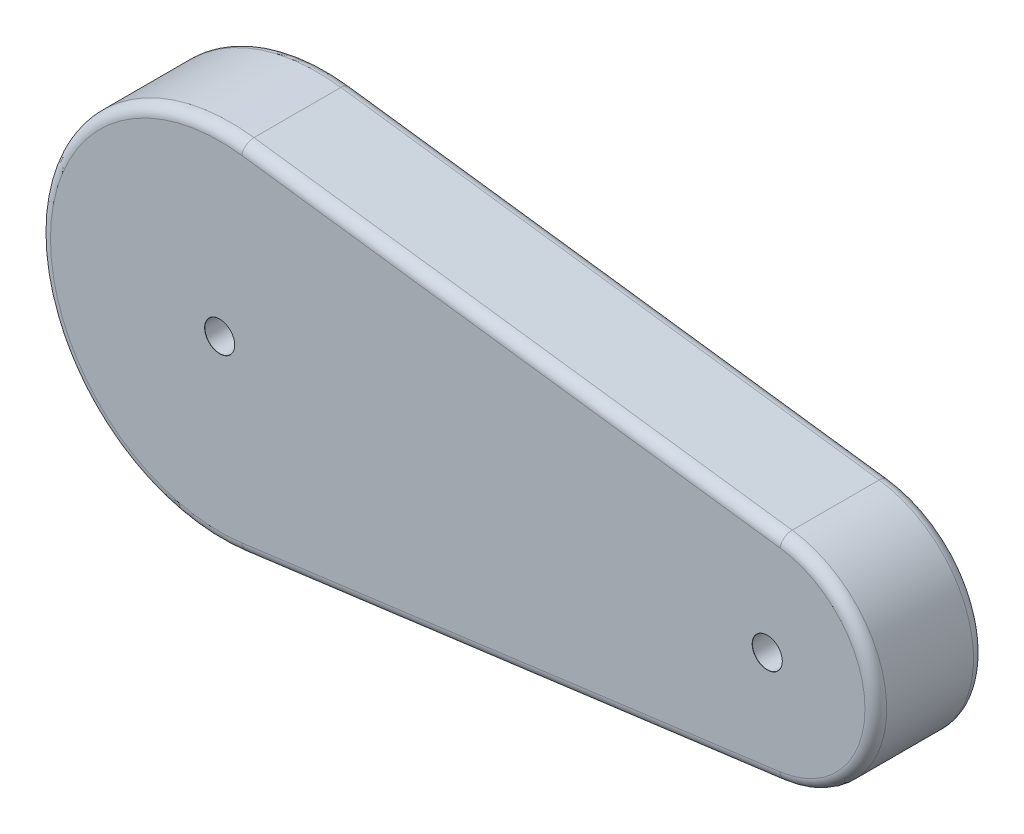
ISO-10303-21;
HEADER;
FILE_DESCRIPTION(('STEP AP214'),'2;1');
FILE_NAME('part.step','',(''),(''),'','','');
FILE_SCHEMA(('AUTOMOTIVE_DESIGN { 1 0 10303 214 1 1 1 1 }'));
ENDSEC;
DATA;
#1=APPLICATION_CONTEXT('core data for automotive mechanical design processes');
#2=APPLICATION_PROTOCOL_DEFINITION('international standard','automotive_design',2000,#1);
#3=PRODUCT_CONTEXT('',#1,'mechanical');
#4=PRODUCT('Part','Part','',(#3));
#5=PRODUCT_RELATED_PRODUCT_CATEGORY('part','',(#4));
#6=PRODUCT_DEFINITION_FORMATION('','',#4);
#7=PRODUCT_DEFINITION_CONTEXT('part definition',#1,'design');
#8=PRODUCT_DEFINITION('design','',#6,#7);
#9=PRODUCT_DEFINITION_SHAPE('','',#8);
#10=(LENGTH_UNIT() NAMED_UNIT(*) SI_UNIT(.MILLI.,.METRE.));
#11=(NAMED_UNIT(*) PLANE_ANGLE_UNIT() SI_UNIT($,.RADIAN.));
#12=(NAMED_UNIT(*) SI_UNIT($,.STERADIAN.) SOLID_ANGLE_UNIT());
#13=UNCERTAINTY_MEASURE_WITH_UNIT(LENGTH_MEASURE(1.E-05),#10,'distance_accuracy_value','');
#14=(GEOMETRIC_REPRESENTATION_CONTEXT(3) GLOBAL_UNCERTAINTY_ASSIGNED_CONTEXT((#13)) GLOBAL_UNIT_ASSIGNED_CONTEXT((#10,
#11,#12)) REPRESENTATION_CONTEXT('',''));
#15=CARTESIAN_POINT('',(0.,0.,0.));
#16=DIRECTION('',(0.,0.,1.));
#17=DIRECTION('',(1.,0.,0.));
#18=AXIS2_PLACEMENT_3D('',#15,#16,#17);
#19=CARTESIAN_POINT('',(-50.4314480290076,0.,10.));
#20=DIRECTION('',(0.,0.,-1.));
#21=DIRECTION('',(-1.,0.,0.));
#22=AXIS2_PLACEMENT_3D('',#19,#20,#21);
#23=CYLINDRICAL_SURFACE('',#22,33.1652497587393);
#24=DIRECTION('',(0.,0.,-1.));
#25=VECTOR('',#24,1.);
#26=CARTESIAN_POINT('',(-46.1025142639725,32.8815164494811,10.));
#27=LINE('',#26,#25);
#28=CARTESIAN_POINT('',(-46.1025142639725,32.8815164494811,8.));
#29=VERTEX_POINT('',#28);
#30=CARTESIAN_POINT('',(-46.1025142639725,32.8815164494811,-8.));
#31=VERTEX_POINT('',#30);
#32=EDGE_CURVE('E104',#29,#31,#27,.T.);
#33=ORIENTED_EDGE('',*,*,#32,.T.);
#34=CARTESIAN_POINT('',(-50.4314480290076,0.,-8.));
#35=DIRECTION('',(0.,0.,-1.));
#36=DIRECTION('',(-1.,0.,0.));
#37=AXIS2_PLACEMENT_3D('',#34,#35,#36);
#38=CIRCLE('',#37,33.1652497587393);
#39=CARTESIAN_POINT('',(-46.1025142639725,-32.8815164494811,-8.));
#40=VERTEX_POINT('',#39);
#41=EDGE_CURVE('E201',#31,#40,#38,.F.);
#42=ORIENTED_EDGE('',*,*,#41,.T.);
#43=DIRECTION('',(0.,0.,-1.));
#44=VECTOR('',#43,1.);
#45=CARTESIAN_POINT('',(-46.1025142639725,-32.8815164494811,10.));
#46=LINE('',#45,#44);
#47=CARTESIAN_POINT('',(-46.1025142639725,-32.8815164494811,8.));
#48=VERTEX_POINT('',#47);
#49=EDGE_CURVE('E130',#48,#40,#46,.T.);
#50=ORIENTED_EDGE('',*,*,#49,.F.);
#51=CARTESIAN_POINT('',(-50.4314480290076,0.,8.));
#52=DIRECTION('',(0.,0.,-1.));
#53=DIRECTION('',(-1.,0.,0.));
#54=AXIS2_PLACEMENT_3D('',#51,#52,#53);
#55=CIRCLE('',#54,33.1652497587393);
#56=EDGE_CURVE('E199',#48,#29,#55,.T.);
#57=ORIENTED_EDGE('',*,*,#56,.T.);
#58=EDGE_LOOP('',(#33,#42,#50,#57));
#59=FACE_BOUND('',#58,.T.);
#60=ADVANCED_FACE('F33',(#59),#23,.T.);
#61=CARTESIAN_POINT('',(53.0419718734086,-19.8288972274762,10.));
#62=DIRECTION('',(-0.130526192220049,0.991444861373811,0.));
#63=DIRECTION('',(-0.991444861373811,-0.130526192220049,0.));
#64=AXIS2_PLACEMENT_3D('',#61,#62,#63);
#65=PLANE('',#64);
#66=ORIENTED_EDGE('',*,*,#49,.T.);
#67=DIRECTION('',(0.991444861373811,0.130526192220049,0.));
#68=VECTOR('',#67,1.);
#69=CARTESIAN_POINT('',(53.0419718734086,-19.8288972274762,-8.));
#70=LINE('',#69,#68);
#71=CARTESIAN_POINT('',(53.0419718734086,-19.8288972274762,-8.));
#72=VERTEX_POINT('',#71);
#73=EDGE_CURVE('E197',#40,#72,#70,.T.);
#74=ORIENTED_EDGE('',*,*,#73,.T.);
#75=DIRECTION('',(0.,0.,-1.));
#76=VECTOR('',#75,1.);
#77=CARTESIAN_POINT('',(53.0419718734086,-19.8288972274762,10.));
#78=LINE('',#77,#76);
#79=CARTESIAN_POINT('',(53.0419718734086,-19.8288972274762,8.));
#80=VERTEX_POINT('',#79);
#81=EDGE_CURVE('E121',#80,#72,#78,.T.);
#82=ORIENTED_EDGE('',*,*,#81,.F.);
#83=DIRECTION('',(0.991444861373811,0.130526192220049,0.));
#84=VECTOR('',#83,1.);
#85=CARTESIAN_POINT('',(53.0419718734086,-19.8288972274762,8.));
#86=LINE('',#85,#84);
#87=EDGE_CURVE('E195',#80,#48,#86,.F.);
#88=ORIENTED_EDGE('',*,*,#87,.T.);
#89=EDGE_LOOP('',(#66,#74,#82,#88));
#90=FACE_BOUND('',#89,.T.);
#91=ADVANCED_FACE('F213',(#90),#65,.F.);
#92=CARTESIAN_POINT('',(50.4314480290076,0.,10.));
#93=DIRECTION('',(0.,0.,-1.));
#94=DIRECTION('',(-1.,0.,0.));
#95=AXIS2_PLACEMENT_3D('',#92,#93,#94);
#96=CYLINDRICAL_SURFACE('',#95,20.);
#97=ORIENTED_EDGE('',*,*,#81,.T.);
#98=CARTESIAN_POINT('',(50.4314480290076,0.,-8.));
#99=DIRECTION('',(0.,0.,-1.));
#100=DIRECTION('',(-1.,0.,0.));
#101=AXIS2_PLACEMENT_3D('',#98,#99,#100);
#102=CIRCLE('',#101,20.);
#103=CARTESIAN_POINT('',(53.0419718734086,19.8288972274762,-8.));
#104=VERTEX_POINT('',#103);
#105=EDGE_CURVE('E120',#72,#104,#102,.F.);
#106=ORIENTED_EDGE('',*,*,#105,.T.);
#107=DIRECTION('',(0.,0.,-1.));
#108=VECTOR('',#107,1.);
#109=CARTESIAN_POINT('',(53.0419718734086,19.8288972274762,10.));
#110=LINE('',#109,#108);
#111=CARTESIAN_POINT('',(53.0419718734086,19.8288972274762,8.));
#112=VERTEX_POINT('',#111);
#113=EDGE_CURVE('E102',#112,#104,#110,.T.);
#114=ORIENTED_EDGE('',*,*,#113,.F.);
#115=CARTESIAN_POINT('',(50.4314480290076,0.,8.));
#116=DIRECTION('',(0.,0.,-1.));
#117=DIRECTION('',(-1.,0.,0.));
#118=AXIS2_PLACEMENT_3D('',#115,#116,#117);
#119=CIRCLE('',#118,20.);
#120=EDGE_CURVE('E117',#112,#80,#119,.T.);
#121=ORIENTED_EDGE('',*,*,#120,.T.);
#122=EDGE_LOOP('',(#97,#106,#114,#121));
#123=FACE_BOUND('',#122,.T.);
#124=ADVANCED_FACE('F116',(#123),#96,.T.);
#125=CARTESIAN_POINT('',(-46.1025142639725,32.8815164494811,10.));
#126=DIRECTION('',(-0.130526192220048,-0.991444861373811,0.));
#127=DIRECTION('',(0.991444861373811,-0.130526192220048,0.));
#128=AXIS2_PLACEMENT_3D('',#125,#126,#127);
#129=PLANE('',#128);
#130=ORIENTED_EDGE('',*,*,#113,.T.);
#131=DIRECTION('',(-0.991444861373811,0.130526192220048,0.));
#132=VECTOR('',#131,1.);
#133=CARTESIAN_POINT('',(-46.1025142639725,32.8815164494811,-8.));
#134=LINE('',#133,#132);
#135=EDGE_CURVE('E11',#104,#31,#134,.T.);
#136=ORIENTED_EDGE('',*,*,#135,.T.);
#137=ORIENTED_EDGE('',*,*,#32,.F.);
#138=DIRECTION('',(-0.991444861373811,0.130526192220048,0.));
#139=VECTOR('',#138,1.);
#140=CARTESIAN_POINT('',(-46.1025142639725,32.8815164494811,8.));
#141=LINE('',#140,#139);
#142=EDGE_CURVE('E42',#29,#112,#141,.F.);
#143=ORIENTED_EDGE('',*,*,#142,.T.);
#144=EDGE_LOOP('',(#130,#136,#137,#143));
#145=FACE_BOUND('',#144,.T.);
#146=ADVANCED_FACE('F101',(#145),#129,.F.);
#147=CARTESIAN_POINT('',(-50.4314480290076,0.,10.));
#148=DIRECTION('',(0.,0.,-1.));
#149=DIRECTION('',(-1.,0.,0.));
#150=AXIS2_PLACEMENT_3D('',#147,#148,#149);
#151=PLANE('',#150);
#152=DIRECTION('',(0.991444861373811,0.130526192220049,0.));
#153=VECTOR('',#152,1.);
#154=CARTESIAN_POINT('',(-46.3635666484126,-30.8986267267335,10.));
#155=LINE('',#154,#153);
#156=CARTESIAN_POINT('',(-46.3635666484126,-30.8986267267335,10.));
#157=VERTEX_POINT('',#156);
#158=CARTESIAN_POINT('',(52.7809194889685,-17.8460075047286,10.));
#159=VERTEX_POINT('',#158);
#160=EDGE_CURVE('E50',#157,#159,#155,.T.);
#161=ORIENTED_EDGE('',*,*,#160,.T.);
#162=CARTESIAN_POINT('',(50.4314480290076,0.,10.));
#163=DIRECTION('',(0.,0.,-1.));
#164=DIRECTION('',(-1.,0.,0.));
#165=AXIS2_PLACEMENT_3D('',#162,#163,#164);
#166=CIRCLE('',#165,18.);
#167=CARTESIAN_POINT('',(52.7809194889685,17.8460075047286,10.));
#168=VERTEX_POINT('',#167);
#169=EDGE_CURVE('E109',#159,#168,#166,.F.);
#170=ORIENTED_EDGE('',*,*,#169,.T.);
#171=DIRECTION('',(-0.991444861373811,0.130526192220048,0.));
#172=VECTOR('',#171,1.);
#173=CARTESIAN_POINT('',(-46.3635666484126,30.8986267267334,10.));
#174=LINE('',#173,#172);
#175=CARTESIAN_POINT('',(-46.3635666484126,30.8986267267334,10.));
#176=VERTEX_POINT('',#175);
#177=EDGE_CURVE('E133',#168,#176,#174,.T.);
#178=ORIENTED_EDGE('',*,*,#177,.T.);
#179=CARTESIAN_POINT('',(-50.4314480290076,0.,10.));
#180=DIRECTION('',(0.,0.,-1.));
#181=DIRECTION('',(-1.,0.,0.));
#182=AXIS2_PLACEMENT_3D('',#179,#180,#181);
#183=CIRCLE('',#182,31.1652497587393);
#184=EDGE_CURVE('E55',#176,#157,#183,.F.);
#185=ORIENTED_EDGE('',*,*,#184,.T.);
#186=EDGE_LOOP('',(#161,#170,#178,#185));
#187=FACE_BOUND('',#186,.T.);
#188=CARTESIAN_POINT('',(-50.4314480290076,0.,10.));
#189=DIRECTION('',(0.,0.,1.));
#190=DIRECTION('',(1.,0.,0.));
#191=AXIS2_PLACEMENT_3D('',#188,#189,#190);
#192=CIRCLE('',#191,2.775);
#193=CARTESIAN_POINT('',(-47.6564480290076,0.,10.));
#194=VERTEX_POINT('',#193);
#195=EDGE_CURVE('E156',#194,#194,#192,.T.);
#196=ORIENTED_EDGE('',*,*,#195,.F.);
#197=EDGE_LOOP('',(#196));
#198=FACE_BOUND('',#197,.T.);
#199=CARTESIAN_POINT('',(50.4314480290076,0.,10.));
#200=DIRECTION('',(0.,0.,1.));
#201=DIRECTION('',(1.,0.,0.));
#202=AXIS2_PLACEMENT_3D('',#199,#200,#201);
#203=CIRCLE('',#202,2.775);
#204=CARTESIAN_POINT('',(53.2064480290076,0.,10.));
#205=VERTEX_POINT('',#204);
#206=EDGE_CURVE('E172',#205,#205,#203,.T.);
#207=ORIENTED_EDGE('',*,*,#206,.F.);
#208=EDGE_LOOP('',(#207));
#209=FACE_BOUND('',#208,.T.);
#210=ADVANCED_FACE('F206',(#187,#198,#209),#151,.F.);
#211=CARTESIAN_POINT('',(-50.4314480290076,0.,-10.));
#212=DIRECTION('',(0.,0.,-1.));
#213=DIRECTION('',(-1.,0.,0.));
#214=AXIS2_PLACEMENT_3D('',#211,#212,#213);
#215=PLANE('',#214);
#216=DIRECTION('',(-0.991444861373811,0.130526192220048,0.));
#217=VECTOR('',#216,1.);
#218=CARTESIAN_POINT('',(52.7809194889685,17.8460075047286,-10.));
#219=LINE('',#218,#217);
#220=CARTESIAN_POINT('',(-46.3635666484126,30.8986267267334,-10.));
#221=VERTEX_POINT('',#220);
#222=CARTESIAN_POINT('',(52.7809194889685,17.8460075047286,-10.));
#223=VERTEX_POINT('',#222);
#224=EDGE_CURVE('E186',#221,#223,#219,.F.);
#225=ORIENTED_EDGE('',*,*,#224,.T.);
#226=CARTESIAN_POINT('',(50.4314480290076,0.,-10.));
#227=DIRECTION('',(0.,0.,-1.));
#228=DIRECTION('',(-1.,0.,0.));
#229=AXIS2_PLACEMENT_3D('',#226,#227,#228);
#230=CIRCLE('',#229,18.);
#231=CARTESIAN_POINT('',(52.7809194889685,-17.8460075047286,-10.));
#232=VERTEX_POINT('',#231);
#233=EDGE_CURVE('E192',#223,#232,#230,.T.);
#234=ORIENTED_EDGE('',*,*,#233,.T.);
#235=DIRECTION('',(0.991444861373811,0.130526192220049,0.));
#236=VECTOR('',#235,1.);
#237=CARTESIAN_POINT('',(-46.3635666484126,-30.8986267267335,-10.));
#238=LINE('',#237,#236);
#239=CARTESIAN_POINT('',(-46.3635666484126,-30.8986267267335,-10.));
#240=VERTEX_POINT('',#239);
#241=EDGE_CURVE('E190',#232,#240,#238,.F.);
#242=ORIENTED_EDGE('',*,*,#241,.T.);
#243=CARTESIAN_POINT('',(-50.4314480290076,0.,-10.));
#244=DIRECTION('',(0.,0.,-1.));
#245=DIRECTION('',(-1.,0.,0.));
#246=AXIS2_PLACEMENT_3D('',#243,#244,#245);
#247=CIRCLE('',#246,31.1652497587393);
#248=EDGE_CURVE('E188',#240,#221,#247,.T.);
#249=ORIENTED_EDGE('',*,*,#248,.T.);
#250=EDGE_LOOP('',(#225,#234,#242,#249));
#251=FACE_BOUND('',#250,.T.);
#252=CARTESIAN_POINT('',(-50.4314480290076,0.,-10.));
#253=DIRECTION('',(0.,0.,1.));
#254=DIRECTION('',(1.,0.,0.));
#255=AXIS2_PLACEMENT_3D('',#252,#253,#254);
#256=CIRCLE('',#255,2.75);
#257=CARTESIAN_POINT('',(-47.6814480290076,0.,-10.));
#258=VERTEX_POINT('',#257);
#259=EDGE_CURVE('E167',#258,#258,#256,.T.);
#260=ORIENTED_EDGE('',*,*,#259,.T.);
#261=EDGE_LOOP('',(#260));
#262=FACE_BOUND('',#261,.T.);
#263=CARTESIAN_POINT('',(50.4314480290076,0.,-10.));
#264=DIRECTION('',(0.,0.,1.));
#265=DIRECTION('',(1.,0.,0.));
#266=AXIS2_PLACEMENT_3D('',#263,#264,#265);
#267=CIRCLE('',#266,2.75);
#268=CARTESIAN_POINT('',(53.1814480290076,0.,-10.));
#269=VERTEX_POINT('',#268);
#270=EDGE_CURVE('E178',#269,#269,#267,.T.);
#271=ORIENTED_EDGE('',*,*,#270,.T.);
#272=EDGE_LOOP('',(#271));
#273=FACE_BOUND('',#272,.T.);
#274=ADVANCED_FACE('F241',(#251,#262,#273),#215,.T.);
#275=CARTESIAN_POINT('',(50.4314480290076,0.,10.));
#276=DIRECTION('',(0.,0.,1.));
#277=DIRECTION('',(1.,0.,0.));
#278=AXIS2_PLACEMENT_3D('',#275,#276,#277);
#279=CYLINDRICAL_SURFACE('',#278,2.75);
#280=ORIENTED_EDGE('',*,*,#270,.F.);
#281=EDGE_LOOP('',(#280));
#282=FACE_BOUND('',#281,.T.);
#283=CARTESIAN_POINT('',(50.4314480290076,0.,9.975));
#284=DIRECTION('',(0.,0.,1.));
#285=DIRECTION('',(1.,0.,0.));
#286=AXIS2_PLACEMENT_3D('',#283,#284,#285);
#287=CIRCLE('',#286,2.75);
#288=CARTESIAN_POINT('',(53.1814480290076,0.,9.975));
#289=VERTEX_POINT('',#288);
#290=EDGE_CURVE('E175',#289,#289,#287,.T.);
#291=ORIENTED_EDGE('',*,*,#290,.T.);
#292=EDGE_LOOP('',(#291));
#293=FACE_BOUND('',#292,.T.);
#294=ADVANCED_FACE('F244',(#282,#293),#279,.F.);
#295=CARTESIAN_POINT('',(50.4314480290076,0.,10.));
#296=DIRECTION('',(0.,0.,1.));
#297=DIRECTION('',(1.,0.,0.));
#298=AXIS2_PLACEMENT_3D('',#295,#296,#297);
#299=CONICAL_SURFACE('',#298,2.775,0.78539816339731);
#300=ORIENTED_EDGE('',*,*,#290,.F.);
#301=EDGE_LOOP('',(#300));
#302=FACE_BOUND('',#301,.T.);
#303=ORIENTED_EDGE('',*,*,#206,.T.);
#304=EDGE_LOOP('',(#303));
#305=FACE_BOUND('',#304,.T.);
#306=ADVANCED_FACE('F250',(#302,#305),#299,.F.);
#307=CARTESIAN_POINT('',(-50.4314480290076,0.,10.));
#308=DIRECTION('',(0.,0.,1.));
#309=DIRECTION('',(1.,0.,0.));
#310=AXIS2_PLACEMENT_3D('',#307,#308,#309);
#311=CYLINDRICAL_SURFACE('',#310,2.75);
#312=ORIENTED_EDGE('',*,*,#259,.F.);
#313=EDGE_LOOP('',(#312));
#314=FACE_BOUND('',#313,.T.);
#315=CARTESIAN_POINT('',(-50.4314480290076,0.,9.975));
#316=DIRECTION('',(0.,0.,1.));
#317=DIRECTION('',(1.,0.,0.));
#318=AXIS2_PLACEMENT_3D('',#315,#316,#317);
#319=CIRCLE('',#318,2.75);
#320=CARTESIAN_POINT('',(-47.6814480290076,0.,9.975));
#321=VERTEX_POINT('',#320);
#322=EDGE_CURVE('E162',#321,#321,#319,.T.);
#323=ORIENTED_EDGE('',*,*,#322,.T.);
#324=EDGE_LOOP('',(#323));
#325=FACE_BOUND('',#324,.T.);
#326=ADVANCED_FACE('F254',(#314,#325),#311,.F.);
#327=CARTESIAN_POINT('',(-50.4314480290076,0.,10.));
#328=DIRECTION('',(0.,0.,1.));
#329=DIRECTION('',(1.,0.,0.));
#330=AXIS2_PLACEMENT_3D('',#327,#328,#329);
#331=CONICAL_SURFACE('',#330,2.775,0.78539816339731);
#332=ORIENTED_EDGE('',*,*,#322,.F.);
#333=EDGE_LOOP('',(#332));
#334=FACE_BOUND('',#333,.T.);
#335=ORIENTED_EDGE('',*,*,#195,.T.);
#336=EDGE_LOOP('',(#335));
#337=FACE_BOUND('',#336,.T.);
#338=ADVANCED_FACE('F258',(#334,#337),#331,.F.);
#339=CARTESIAN_POINT('',(-50.4314480290076,0.,-8.));
#340=DIRECTION('',(0.,0.,-1.));
#341=DIRECTION('',(-1.,0.,0.));
#342=AXIS2_PLACEMENT_3D('',#339,#340,#341);
#343=TOROIDAL_SURFACE('',#342,31.1652497587393,2.);
#344=CARTESIAN_POINT('',(-46.3635666484126,30.8986267267334,-8.));
#345=DIRECTION('',(0.991444861373811,-0.130526192220048,0.));
#346=DIRECTION('',(0.130526192220048,0.991444861373811,0.));
#347=AXIS2_PLACEMENT_3D('',#344,#345,#346);
#348=CIRCLE('',#347,2.);
#349=EDGE_CURVE('E149',#221,#31,#348,.T.);
#350=ORIENTED_EDGE('',*,*,#349,.F.);
#351=ORIENTED_EDGE('',*,*,#248,.F.);
#352=CARTESIAN_POINT('',(-46.3635666484126,-30.8986267267335,-8.));
#353=DIRECTION('',(0.991444861373811,0.130526192220048,0.));
#354=DIRECTION('',(-0.130526192220048,0.991444861373811,0.));
#355=AXIS2_PLACEMENT_3D('',#352,#353,#354);
#356=CIRCLE('',#355,2.);
#357=EDGE_CURVE('E138',#40,#240,#356,.T.);
#358=ORIENTED_EDGE('',*,*,#357,.F.);
#359=ORIENTED_EDGE('',*,*,#41,.F.);
#360=EDGE_LOOP('',(#350,#351,#358,#359));
#361=FACE_BOUND('',#360,.T.);
#362=ADVANCED_FACE('F217',(#361),#343,.T.);
#363=CARTESIAN_POINT('',(52.7809194889685,-17.8460075047286,-8.));
#364=DIRECTION('',(-0.991444861373811,-0.130526192220049,0.));
#365=DIRECTION('',(0.130526192220049,-0.991444861373811,0.));
#366=AXIS2_PLACEMENT_3D('',#363,#364,#365);
#367=CYLINDRICAL_SURFACE('',#366,2.);
#368=ORIENTED_EDGE('',*,*,#357,.T.);
#369=ORIENTED_EDGE('',*,*,#241,.F.);
#370=CARTESIAN_POINT('',(52.7809194889685,-17.8460075047286,-8.));
#371=DIRECTION('',(0.991444861373811,0.130526192220048,0.));
#372=DIRECTION('',(-0.130526192220048,0.991444861373811,0.));
#373=AXIS2_PLACEMENT_3D('',#370,#371,#372);
#374=CIRCLE('',#373,2.);
#375=EDGE_CURVE('E143',#72,#232,#374,.T.);
#376=ORIENTED_EDGE('',*,*,#375,.F.);
#377=ORIENTED_EDGE('',*,*,#73,.F.);
#378=EDGE_LOOP('',(#368,#369,#376,#377));
#379=FACE_BOUND('',#378,.T.);
#380=ADVANCED_FACE('F220',(#379),#367,.T.);
#381=CARTESIAN_POINT('',(-46.3635666484126,30.8986267267334,-8.));
#382=DIRECTION('',(0.991444861373811,-0.130526192220048,0.));
#383=DIRECTION('',(0.130526192220048,0.991444861373811,0.));
#384=AXIS2_PLACEMENT_3D('',#381,#382,#383);
#385=CYLINDRICAL_SURFACE('',#384,2.);
#386=ORIENTED_EDGE('',*,*,#349,.T.);
#387=ORIENTED_EDGE('',*,*,#135,.F.);
#388=CARTESIAN_POINT('',(52.7809194889685,17.8460075047286,-8.));
#389=DIRECTION('',(0.991444861373811,-0.130526192220048,0.));
#390=DIRECTION('',(0.130526192220048,0.991444861373811,0.));
#391=AXIS2_PLACEMENT_3D('',#388,#389,#390);
#392=CIRCLE('',#391,2.);
#393=EDGE_CURVE('E141',#223,#104,#392,.T.);
#394=ORIENTED_EDGE('',*,*,#393,.F.);
#395=ORIENTED_EDGE('',*,*,#224,.F.);
#396=EDGE_LOOP('',(#386,#387,#394,#395));
#397=FACE_BOUND('',#396,.T.);
#398=ADVANCED_FACE('F223',(#397),#385,.T.);
#399=CARTESIAN_POINT('',(50.4314480290076,0.,-8.));
#400=DIRECTION('',(0.,0.,-1.));
#401=DIRECTION('',(-1.,0.,0.));
#402=AXIS2_PLACEMENT_3D('',#399,#400,#401);
#403=TOROIDAL_SURFACE('',#402,18.,2.);
#404=ORIENTED_EDGE('',*,*,#375,.T.);
#405=ORIENTED_EDGE('',*,*,#233,.F.);
#406=ORIENTED_EDGE('',*,*,#393,.T.);
#407=ORIENTED_EDGE('',*,*,#105,.F.);
#408=EDGE_LOOP('',(#404,#405,#406,#407));
#409=FACE_BOUND('',#408,.T.);
#410=ADVANCED_FACE('F221',(#409),#403,.T.);
#411=CARTESIAN_POINT('',(-50.4314480290076,0.,8.));
#412=DIRECTION('',(0.,0.,-1.));
#413=DIRECTION('',(-1.,0.,0.));
#414=AXIS2_PLACEMENT_3D('',#411,#412,#413);
#415=TOROIDAL_SURFACE('',#414,31.1652497587393,2.);
#416=CARTESIAN_POINT('',(-46.3635666484126,30.8986267267335,8.));
#417=DIRECTION('',(0.991444861373811,-0.130526192220048,0.));
#418=DIRECTION('',(0.130526192220048,0.991444861373811,0.));
#419=AXIS2_PLACEMENT_3D('',#416,#417,#418);
#420=CIRCLE('',#419,2.);
#421=EDGE_CURVE('E135',#29,#176,#420,.T.);
#422=ORIENTED_EDGE('',*,*,#421,.F.);
#423=ORIENTED_EDGE('',*,*,#56,.F.);
#424=CARTESIAN_POINT('',(-46.3635666484126,-30.8986267267335,8.));
#425=DIRECTION('',(0.991444861373811,0.130526192220047,0.));
#426=DIRECTION('',(-0.130526192220047,0.991444861373811,0.));
#427=AXIS2_PLACEMENT_3D('',#424,#425,#426);
#428=CIRCLE('',#427,2.);
#429=EDGE_CURVE('E37',#157,#48,#428,.T.);
#430=ORIENTED_EDGE('',*,*,#429,.F.);
#431=ORIENTED_EDGE('',*,*,#184,.F.);
#432=EDGE_LOOP('',(#422,#423,#430,#431));
#433=FACE_BOUND('',#432,.T.);
#434=ADVANCED_FACE('F35',(#433),#415,.T.);
#435=CARTESIAN_POINT('',(-46.3635666484126,-30.8986267267335,8.));
#436=DIRECTION('',(0.991444861373811,0.130526192220049,0.));
#437=DIRECTION('',(-0.130526192220049,0.991444861373811,0.));
#438=AXIS2_PLACEMENT_3D('',#435,#436,#437);
#439=CYLINDRICAL_SURFACE('',#438,2.);
#440=ORIENTED_EDGE('',*,*,#429,.T.);
#441=ORIENTED_EDGE('',*,*,#87,.F.);
#442=CARTESIAN_POINT('',(52.7809194889685,-17.8460075047286,8.));
#443=DIRECTION('',(0.991444861373811,0.130526192220048,0.));
#444=DIRECTION('',(-0.130526192220048,0.991444861373811,0.));
#445=AXIS2_PLACEMENT_3D('',#442,#443,#444);
#446=CIRCLE('',#445,2.);
#447=EDGE_CURVE('E128',#159,#80,#446,.T.);
#448=ORIENTED_EDGE('',*,*,#447,.F.);
#449=ORIENTED_EDGE('',*,*,#160,.F.);
#450=EDGE_LOOP('',(#440,#441,#448,#449));
#451=FACE_BOUND('',#450,.T.);
#452=ADVANCED_FACE('F210',(#451),#439,.T.);
#453=CARTESIAN_POINT('',(-46.3635666484126,30.8986267267334,8.));
#454=DIRECTION('',(-0.991444861373811,0.130526192220048,0.));
#455=DIRECTION('',(-0.130526192220048,-0.991444861373811,0.));
#456=AXIS2_PLACEMENT_3D('',#453,#454,#455);
#457=CYLINDRICAL_SURFACE('',#456,2.);
#458=ORIENTED_EDGE('',*,*,#421,.T.);
#459=ORIENTED_EDGE('',*,*,#177,.F.);
#460=CARTESIAN_POINT('',(52.7809194889685,17.8460075047286,8.));
#461=DIRECTION('',(0.991444861373811,-0.130526192220048,0.));
#462=DIRECTION('',(0.130526192220048,0.991444861373811,0.));
#463=AXIS2_PLACEMENT_3D('',#460,#461,#462);
#464=CIRCLE('',#463,2.);
#465=EDGE_CURVE('E126',#112,#168,#464,.T.);
#466=ORIENTED_EDGE('',*,*,#465,.F.);
#467=ORIENTED_EDGE('',*,*,#142,.F.);
#468=EDGE_LOOP('',(#458,#459,#466,#467));
#469=FACE_BOUND('',#468,.T.);
#470=ADVANCED_FACE('F132',(#469),#457,.T.);
#471=CARTESIAN_POINT('',(50.4314480290076,0.,8.));
#472=DIRECTION('',(0.,0.,-1.));
#473=DIRECTION('',(-1.,0.,0.));
#474=AXIS2_PLACEMENT_3D('',#471,#472,#473);
#475=TOROIDAL_SURFACE('',#474,18.,2.);
#476=ORIENTED_EDGE('',*,*,#447,.T.);
#477=ORIENTED_EDGE('',*,*,#120,.F.);
#478=ORIENTED_EDGE('',*,*,#465,.T.);
#479=ORIENTED_EDGE('',*,*,#169,.F.);
#480=EDGE_LOOP('',(#476,#477,#478,#479));
#481=FACE_BOUND('',#480,.T.);
#482=ADVANCED_FACE('F124',(#481),#475,.T.);
#483=CLOSED_SHELL('',(#60,#91,#124,#146,#210,#274,#294,#306,#326,#338,#362,#380,#398,#410,#434,
#452,#470,#482));
#484=MANIFOLD_SOLID_BREP('B2',#483);
#485=ADVANCED_BREP_SHAPE_REPRESENTATION('',(#18,#484),#14);
#486=SHAPE_DEFINITION_REPRESENTATION(#9,#485);
ENDSEC;
END-ISO-10303-21;
